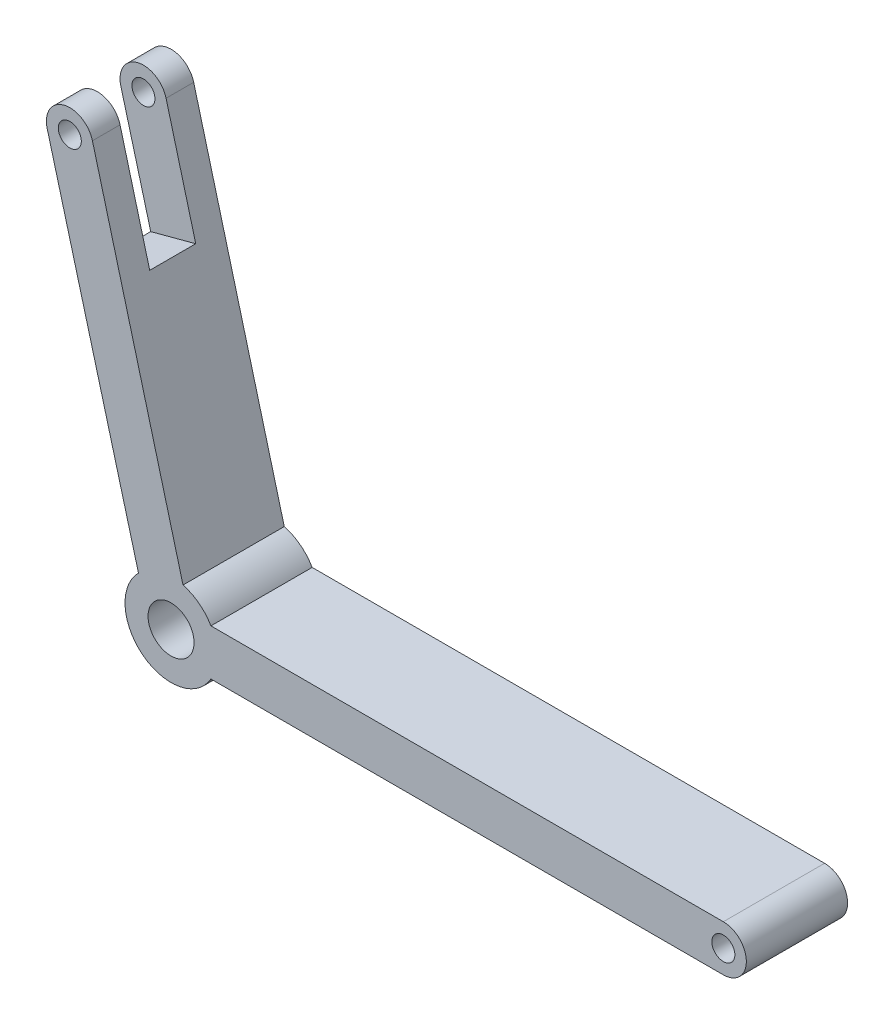
ISO-10303-21;
HEADER;
FILE_DESCRIPTION(('STEP AP214'),'2;1');
FILE_NAME('part.step','',(''),(''),'','','');
FILE_SCHEMA(('AUTOMOTIVE_DESIGN { 1 0 10303 214 1 1 1 1 }'));
ENDSEC;
DATA;
#1=APPLICATION_CONTEXT('core data for automotive mechanical design processes');
#2=APPLICATION_PROTOCOL_DEFINITION('international standard','automotive_design',2000,#1);
#3=PRODUCT_CONTEXT('',#1,'mechanical');
#4=PRODUCT('Part','Part','',(#3));
#5=PRODUCT_RELATED_PRODUCT_CATEGORY('part','',(#4));
#6=PRODUCT_DEFINITION_FORMATION('','',#4);
#7=PRODUCT_DEFINITION_CONTEXT('part definition',#1,'design');
#8=PRODUCT_DEFINITION('design','',#6,#7);
#9=PRODUCT_DEFINITION_SHAPE('','',#8);
#10=(LENGTH_UNIT() NAMED_UNIT(*) SI_UNIT(.MILLI.,.METRE.));
#11=(NAMED_UNIT(*) PLANE_ANGLE_UNIT() SI_UNIT($,.RADIAN.));
#12=(NAMED_UNIT(*) SI_UNIT($,.STERADIAN.) SOLID_ANGLE_UNIT());
#13=UNCERTAINTY_MEASURE_WITH_UNIT(LENGTH_MEASURE(1.E-05),#10,'distance_accuracy_value','');
#14=(GEOMETRIC_REPRESENTATION_CONTEXT(3) GLOBAL_UNCERTAINTY_ASSIGNED_CONTEXT((#13)) GLOBAL_UNIT_ASSIGNED_CONTEXT((#10,
#11,#12)) REPRESENTATION_CONTEXT('',''));
#15=CARTESIAN_POINT('',(0.,0.,0.));
#16=DIRECTION('',(0.,0.,1.));
#17=DIRECTION('',(1.,0.,0.));
#18=AXIS2_PLACEMENT_3D('',#15,#16,#17);
#19=CARTESIAN_POINT('',(82.9161224789474,118.415426808269,11.));
#20=DIRECTION('',(-0.966192489957133,-0.257821784088224,0.));
#21=DIRECTION('',(0.257821784088224,-0.966192489957133,0.));
#22=AXIS2_PLACEMENT_3D('',#19,#20,#21);
#23=PLANE('',#22);
#24=DIRECTION('',(-0.257821784088224,0.966192489957133,0.));
#25=VECTOR('',#24,1.);
#26=CARTESIAN_POINT('',(89.361667081153,94.2606145593405,-5.));
#27=LINE('',#26,#25);
#28=CARTESIAN_POINT('',(89.361667081153,94.2606145593405,-5.));
#29=VERTEX_POINT('',#28);
#30=CARTESIAN_POINT('',(82.9161224789474,118.415426808269,-5.));
#31=VERTEX_POINT('',#30);
#32=EDGE_CURVE('E221',#29,#31,#27,.T.);
#33=ORIENTED_EDGE('',*,*,#32,.F.);
#34=DIRECTION('',(0.,0.,1.));
#35=VECTOR('',#34,1.);
#36=CARTESIAN_POINT('',(89.361667081153,94.2606145593405,-5.));
#37=LINE('',#36,#35);
#38=CARTESIAN_POINT('',(89.361667081153,94.2606145593405,5.));
#39=VERTEX_POINT('',#38);
#40=EDGE_CURVE('E216',#29,#39,#37,.T.);
#41=ORIENTED_EDGE('',*,*,#40,.T.);
#42=DIRECTION('',(-0.257821784088224,0.966192489957133,0.));
#43=VECTOR('',#42,1.);
#44=CARTESIAN_POINT('',(89.361667081153,94.2606145593405,5.));
#45=LINE('',#44,#43);
#46=CARTESIAN_POINT('',(82.9161224789474,118.415426808269,5.));
#47=VERTEX_POINT('',#46);
#48=EDGE_CURVE('E132',#39,#47,#45,.T.);
#49=ORIENTED_EDGE('',*,*,#48,.T.);
#50=DIRECTION('',(0.,0.,-1.));
#51=VECTOR('',#50,1.);
#52=CARTESIAN_POINT('',(82.9161224789474,118.415426808269,11.));
#53=LINE('',#52,#51);
#54=CARTESIAN_POINT('',(82.9161224789474,118.415426808269,11.));
#55=VERTEX_POINT('',#54);
#56=EDGE_CURVE('E129',#55,#47,#53,.T.);
#57=ORIENTED_EDGE('',*,*,#56,.F.);
#58=DIRECTION('',(-0.257821784088224,0.966192489957133,0.));
#59=VECTOR('',#58,1.);
#60=CARTESIAN_POINT('',(82.9161224789474,118.415426808269,11.));
#61=LINE('',#60,#59);
#62=CARTESIAN_POINT('',(102.598160303091,44.6565813329273,11.));
#63=VERTEX_POINT('',#62);
#64=EDGE_CURVE('E114',#63,#55,#61,.T.);
#65=ORIENTED_EDGE('',*,*,#64,.F.);
#66=DIRECTION('',(0.,0.,-1.));
#67=VECTOR('',#66,1.);
#68=CARTESIAN_POINT('',(102.598160303091,44.6565813329273,11.));
#69=LINE('',#68,#67);
#70=CARTESIAN_POINT('',(102.598160303091,44.6565813329273,-11.));
#71=VERTEX_POINT('',#70);
#72=EDGE_CURVE('E135',#63,#71,#69,.T.);
#73=ORIENTED_EDGE('',*,*,#72,.T.);
#74=DIRECTION('',(-0.257821784088224,0.966192489957133,0.));
#75=VECTOR('',#74,1.);
#76=CARTESIAN_POINT('',(82.9161224789474,118.415426808269,-11.));
#77=LINE('',#76,#75);
#78=CARTESIAN_POINT('',(82.9161224789474,118.415426808269,-11.));
#79=VERTEX_POINT('',#78);
#80=EDGE_CURVE('E158',#71,#79,#77,.T.);
#81=ORIENTED_EDGE('',*,*,#80,.T.);
#82=EDGE_CURVE('E136',#31,#79,#53,.T.);
#83=ORIENTED_EDGE('',*,*,#82,.F.);
#84=EDGE_LOOP('',(#33,#41,#49,#57,#65,#73,#81,#83));
#85=FACE_BOUND('',#84,.T.);
#86=ADVANCED_FACE('F34',(#85),#23,.F.);
#87=CARTESIAN_POINT('',(78.000381166286,117.103695234571,11.));
#88=DIRECTION('',(0.,0.,-1.));
#89=DIRECTION('',(-1.,0.,0.));
#90=AXIS2_PLACEMENT_3D('',#87,#88,#89);
#91=CYLINDRICAL_SURFACE('',#90,5.08774531344114);
#92=CARTESIAN_POINT('',(78.000381166286,117.103695234571,-5.));
#93=DIRECTION('',(0.,0.,1.));
#94=DIRECTION('',(1.,0.,0.));
#95=AXIS2_PLACEMENT_3D('',#92,#93,#94);
#96=CIRCLE('',#95,5.08774531344114);
#97=CARTESIAN_POINT('',(73.0873585242395,115.781817444009,-5.));
#98=VERTEX_POINT('',#97);
#99=EDGE_CURVE('E224',#31,#98,#96,.T.);
#100=ORIENTED_EDGE('',*,*,#99,.F.);
#101=ORIENTED_EDGE('',*,*,#82,.T.);
#102=CARTESIAN_POINT('',(78.000381166286,117.103695234571,-11.));
#103=DIRECTION('',(0.,0.,1.));
#104=DIRECTION('',(1.,0.,0.));
#105=AXIS2_PLACEMENT_3D('',#102,#103,#104);
#106=CIRCLE('',#105,5.08774531344114);
#107=CARTESIAN_POINT('',(73.0873585242395,115.781817444009,-11.));
#108=VERTEX_POINT('',#107);
#109=EDGE_CURVE('E161',#79,#108,#106,.T.);
#110=ORIENTED_EDGE('',*,*,#109,.T.);
#111=DIRECTION('',(0.,0.,-1.));
#112=VECTOR('',#111,1.);
#113=CARTESIAN_POINT('',(73.0873585242395,115.781817444009,11.));
#114=LINE('',#113,#112);
#115=EDGE_CURVE('E167',#98,#108,#114,.T.);
#116=ORIENTED_EDGE('',*,*,#115,.F.);
#117=EDGE_LOOP('',(#100,#101,#110,#116));
#118=FACE_BOUND('',#117,.T.);
#119=ADVANCED_FACE('F266',(#118),#91,.T.);
#120=CARTESIAN_POINT('',(92.921636507955,42.06376459648,11.));
#121=DIRECTION('',(0.965658133292732,0.259816030309133,0.));
#122=DIRECTION('',(-0.259816030309133,0.965658133292732,0.));
#123=AXIS2_PLACEMENT_3D('',#120,#121,#122);
#124=PLANE('',#123);
#125=DIRECTION('',(0.259816030309133,-0.965658133292732,0.));
#126=VECTOR('',#125,1.);
#127=CARTESIAN_POINT('',(73.0873585242395,115.781817444009,-5.));
#128=LINE('',#127,#126);
#129=CARTESIAN_POINT('',(79.5800439780527,91.6504560806383,-5.));
#130=VERTEX_POINT('',#129);
#131=EDGE_CURVE('E237',#98,#130,#128,.T.);
#132=ORIENTED_EDGE('',*,*,#131,.F.);
#133=ORIENTED_EDGE('',*,*,#115,.T.);
#134=DIRECTION('',(0.259816030309133,-0.965658133292732,0.));
#135=VECTOR('',#134,1.);
#136=CARTESIAN_POINT('',(92.921636507955,42.06376459648,-11.));
#137=LINE('',#136,#135);
#138=CARTESIAN_POINT('',(92.921636507955,42.06376459648,-11.));
#139=VERTEX_POINT('',#138);
#140=EDGE_CURVE('E90',#108,#139,#137,.T.);
#141=ORIENTED_EDGE('',*,*,#140,.T.);
#142=DIRECTION('',(0.,0.,-1.));
#143=VECTOR('',#142,1.);
#144=CARTESIAN_POINT('',(92.921636507955,42.06376459648,11.));
#145=LINE('',#144,#143);
#146=CARTESIAN_POINT('',(92.921636507955,42.06376459648,11.));
#147=VERTEX_POINT('',#146);
#148=EDGE_CURVE('E142',#147,#139,#145,.T.);
#149=ORIENTED_EDGE('',*,*,#148,.F.);
#150=DIRECTION('',(0.259816030309133,-0.965658133292732,0.));
#151=VECTOR('',#150,1.);
#152=CARTESIAN_POINT('',(92.921636507955,42.06376459648,11.));
#153=LINE('',#152,#151);
#154=CARTESIAN_POINT('',(73.0873585242395,115.781817444009,11.));
#155=VERTEX_POINT('',#154);
#156=EDGE_CURVE('E58',#155,#147,#153,.T.);
#157=ORIENTED_EDGE('',*,*,#156,.F.);
#158=CARTESIAN_POINT('',(73.0873585242395,115.781817444009,5.));
#159=VERTEX_POINT('',#158);
#160=EDGE_CURVE('E140',#155,#159,#114,.T.);
#161=ORIENTED_EDGE('',*,*,#160,.T.);
#162=DIRECTION('',(0.259816030309133,-0.965658133292732,0.));
#163=VECTOR('',#162,1.);
#164=CARTESIAN_POINT('',(73.0873585242395,115.781817444009,5.));
#165=LINE('',#164,#163);
#166=CARTESIAN_POINT('',(79.5800439780527,91.6504560806383,5.));
#167=VERTEX_POINT('',#166);
#168=EDGE_CURVE('E226',#159,#167,#165,.T.);
#169=ORIENTED_EDGE('',*,*,#168,.T.);
#170=DIRECTION('',(0.,0.,1.));
#171=VECTOR('',#170,1.);
#172=CARTESIAN_POINT('',(79.5800439780527,91.6504560806383,-5.));
#173=LINE('',#172,#171);
#174=EDGE_CURVE('E219',#130,#167,#173,.T.);
#175=ORIENTED_EDGE('',*,*,#174,.F.);
#176=EDGE_LOOP('',(#132,#133,#141,#149,#157,#161,#169,#175));
#177=FACE_BOUND('',#176,.T.);
#178=ADVANCED_FACE('F265',(#177),#124,.F.);
#179=CARTESIAN_POINT('',(78.000381166286,117.103695234571,11.));
#180=DIRECTION('',(0.,0.,-1.));
#181=DIRECTION('',(-1.,0.,0.));
#182=AXIS2_PLACEMENT_3D('',#179,#180,#181);
#183=CYLINDRICAL_SURFACE('',#182,2.5);
#184=CARTESIAN_POINT('',(78.000381166286,117.103695234571,-11.));
#185=DIRECTION('',(0.,0.,1.));
#186=DIRECTION('',(1.,0.,0.));
#187=AXIS2_PLACEMENT_3D('',#184,#185,#186);
#188=CIRCLE('',#187,2.5);
#189=CARTESIAN_POINT('',(80.500381166286,117.103695234571,-11.));
#190=VERTEX_POINT('',#189);
#191=EDGE_CURVE('E201',#190,#190,#188,.T.);
#192=ORIENTED_EDGE('',*,*,#191,.F.);
#193=EDGE_LOOP('',(#192));
#194=FACE_BOUND('',#193,.T.);
#195=CARTESIAN_POINT('',(78.000381166286,117.103695234571,-5.));
#196=DIRECTION('',(0.,0.,1.));
#197=DIRECTION('',(1.,0.,0.));
#198=AXIS2_PLACEMENT_3D('',#195,#196,#197);
#199=CIRCLE('',#198,2.5);
#200=CARTESIAN_POINT('',(80.500381166286,117.103695234571,-5.));
#201=VERTEX_POINT('',#200);
#202=EDGE_CURVE('E231',#201,#201,#199,.T.);
#203=ORIENTED_EDGE('',*,*,#202,.T.);
#204=EDGE_LOOP('',(#203));
#205=FACE_BOUND('',#204,.T.);
#206=ADVANCED_FACE('F248',(#194,#205),#183,.F.);
#207=CARTESIAN_POINT('',(100.,35.,11.));
#208=DIRECTION('',(0.,0.,1.));
#209=DIRECTION('',(1.,0.,0.));
#210=AXIS2_PLACEMENT_3D('',#207,#208,#209);
#211=PLANE('',#210);
#212=CARTESIAN_POINT('',(100.,35.,11.));
#213=DIRECTION('',(0.,0.,1.));
#214=DIRECTION('',(1.,0.,0.));
#215=AXIS2_PLACEMENT_3D('',#212,#213,#214);
#216=CIRCLE('',#215,5.00000000000001);
#217=CARTESIAN_POINT('',(105.,35.,11.));
#218=VERTEX_POINT('',#217);
#219=EDGE_CURVE('E204',#218,#218,#216,.T.);
#220=ORIENTED_EDGE('',*,*,#219,.F.);
#221=EDGE_LOOP('',(#220));
#222=FACE_BOUND('',#221,.T.);
#223=CARTESIAN_POINT('',(100.,35.,11.));
#224=DIRECTION('',(0.,0.,1.));
#225=DIRECTION('',(1.,0.,0.));
#226=AXIS2_PLACEMENT_3D('',#223,#224,#225);
#227=CIRCLE('',#226,9.99999999999999);
#228=CARTESIAN_POINT('',(108.660254037844,30.,11.));
#229=VERTEX_POINT('',#228);
#230=EDGE_CURVE('E165',#147,#229,#227,.T.);
#231=ORIENTED_EDGE('',*,*,#230,.T.);
#232=DIRECTION('',(1.,0.,0.));
#233=VECTOR('',#232,1.);
#234=CARTESIAN_POINT('',(108.660254037844,30.,11.));
#235=LINE('',#234,#233);
#236=CARTESIAN_POINT('',(220.,30.,11.));
#237=VERTEX_POINT('',#236);
#238=EDGE_CURVE('E98',#229,#237,#235,.T.);
#239=ORIENTED_EDGE('',*,*,#238,.T.);
#240=CARTESIAN_POINT('',(220.,35.,11.));
#241=DIRECTION('',(0.,0.,1.));
#242=DIRECTION('',(1.,0.,0.));
#243=AXIS2_PLACEMENT_3D('',#240,#241,#242);
#244=CIRCLE('',#243,5.00000000000002);
#245=CARTESIAN_POINT('',(220.,40.,11.));
#246=VERTEX_POINT('',#245);
#247=EDGE_CURVE('E181',#237,#246,#244,.T.);
#248=ORIENTED_EDGE('',*,*,#247,.T.);
#249=DIRECTION('',(-1.,0.,0.));
#250=VECTOR('',#249,1.);
#251=CARTESIAN_POINT('',(108.660254037844,40.,11.));
#252=LINE('',#251,#250);
#253=CARTESIAN_POINT('',(108.660254037844,40.,11.));
#254=VERTEX_POINT('',#253);
#255=EDGE_CURVE('E195',#246,#254,#252,.T.);
#256=ORIENTED_EDGE('',*,*,#255,.T.);
#257=CARTESIAN_POINT('',(100.,35.,11.));
#258=DIRECTION('',(0.,0.,1.));
#259=DIRECTION('',(1.,0.,0.));
#260=AXIS2_PLACEMENT_3D('',#257,#258,#259);
#261=CIRCLE('',#260,9.99999999999999);
#262=EDGE_CURVE('E122',#254,#63,#261,.T.);
#263=ORIENTED_EDGE('',*,*,#262,.T.);
#264=ORIENTED_EDGE('',*,*,#64,.T.);
#265=CARTESIAN_POINT('',(78.000381166286,117.103695234571,11.));
#266=DIRECTION('',(0.,0.,1.));
#267=DIRECTION('',(1.,0.,0.));
#268=AXIS2_PLACEMENT_3D('',#265,#266,#267);
#269=CIRCLE('',#268,5.08774531344114);
#270=EDGE_CURVE('E119',#55,#155,#269,.T.);
#271=ORIENTED_EDGE('',*,*,#270,.T.);
#272=ORIENTED_EDGE('',*,*,#156,.T.);
#273=EDGE_LOOP('',(#231,#239,#248,#256,#263,#264,#271,#272));
#274=FACE_BOUND('',#273,.T.);
#275=CARTESIAN_POINT('',(78.000381166286,117.103695234571,11.));
#276=DIRECTION('',(0.,0.,1.));
#277=DIRECTION('',(1.,0.,0.));
#278=AXIS2_PLACEMENT_3D('',#275,#276,#277);
#279=CIRCLE('',#278,2.5);
#280=CARTESIAN_POINT('',(80.500381166286,117.103695234571,11.));
#281=VERTEX_POINT('',#280);
#282=EDGE_CURVE('E150',#281,#281,#279,.T.);
#283=ORIENTED_EDGE('',*,*,#282,.F.);
#284=EDGE_LOOP('',(#283));
#285=FACE_BOUND('',#284,.T.);
#286=CARTESIAN_POINT('',(220.,35.,11.));
#287=DIRECTION('',(0.,0.,1.));
#288=DIRECTION('',(1.,0.,0.));
#289=AXIS2_PLACEMENT_3D('',#286,#287,#288);
#290=CIRCLE('',#289,2.5);
#291=CARTESIAN_POINT('',(222.5,35.,11.));
#292=VERTEX_POINT('',#291);
#293=EDGE_CURVE('E210',#292,#292,#290,.T.);
#294=ORIENTED_EDGE('',*,*,#293,.F.);
#295=EDGE_LOOP('',(#294));
#296=FACE_BOUND('',#295,.T.);
#297=ADVANCED_FACE('F116',(#222,#274,#285,#296),#211,.T.);
#298=CARTESIAN_POINT('',(100.,35.,-11.));
#299=DIRECTION('',(0.,0.,1.));
#300=DIRECTION('',(1.,0.,0.));
#301=AXIS2_PLACEMENT_3D('',#298,#299,#300);
#302=PLANE('',#301);
#303=CARTESIAN_POINT('',(100.,35.,-11.));
#304=DIRECTION('',(0.,0.,1.));
#305=DIRECTION('',(1.,0.,0.));
#306=AXIS2_PLACEMENT_3D('',#303,#304,#305);
#307=CIRCLE('',#306,9.99999999999999);
#308=CARTESIAN_POINT('',(108.660254037844,30.,-11.));
#309=VERTEX_POINT('',#308);
#310=EDGE_CURVE('E146',#139,#309,#307,.T.);
#311=ORIENTED_EDGE('',*,*,#310,.F.);
#312=ORIENTED_EDGE('',*,*,#140,.F.);
#313=ORIENTED_EDGE('',*,*,#109,.F.);
#314=ORIENTED_EDGE('',*,*,#80,.F.);
#315=CARTESIAN_POINT('',(100.,35.,-11.));
#316=DIRECTION('',(0.,0.,1.));
#317=DIRECTION('',(1.,0.,0.));
#318=AXIS2_PLACEMENT_3D('',#315,#316,#317);
#319=CIRCLE('',#318,9.99999999999999);
#320=CARTESIAN_POINT('',(108.660254037844,40.,-11.));
#321=VERTEX_POINT('',#320);
#322=EDGE_CURVE('E156',#321,#71,#319,.T.);
#323=ORIENTED_EDGE('',*,*,#322,.F.);
#324=DIRECTION('',(-1.,0.,0.));
#325=VECTOR('',#324,1.);
#326=CARTESIAN_POINT('',(108.660254037844,40.,-11.));
#327=LINE('',#326,#325);
#328=CARTESIAN_POINT('',(220.,40.,-11.));
#329=VERTEX_POINT('',#328);
#330=EDGE_CURVE('E154',#329,#321,#327,.T.);
#331=ORIENTED_EDGE('',*,*,#330,.F.);
#332=CARTESIAN_POINT('',(220.,35.,-11.));
#333=DIRECTION('',(0.,0.,1.));
#334=DIRECTION('',(1.,0.,0.));
#335=AXIS2_PLACEMENT_3D('',#332,#333,#334);
#336=CIRCLE('',#335,5.00000000000002);
#337=CARTESIAN_POINT('',(220.,30.,-11.));
#338=VERTEX_POINT('',#337);
#339=EDGE_CURVE('E152',#338,#329,#336,.T.);
#340=ORIENTED_EDGE('',*,*,#339,.F.);
#341=DIRECTION('',(1.,0.,0.));
#342=VECTOR('',#341,1.);
#343=CARTESIAN_POINT('',(108.660254037844,30.,-11.));
#344=LINE('',#343,#342);
#345=EDGE_CURVE('E149',#309,#338,#344,.T.);
#346=ORIENTED_EDGE('',*,*,#345,.F.);
#347=EDGE_LOOP('',(#311,#312,#313,#314,#323,#331,#340,#346));
#348=FACE_BOUND('',#347,.T.);
#349=ORIENTED_EDGE('',*,*,#191,.T.);
#350=EDGE_LOOP('',(#349));
#351=FACE_BOUND('',#350,.T.);
#352=CARTESIAN_POINT('',(100.,35.,-11.));
#353=DIRECTION('',(0.,0.,1.));
#354=DIRECTION('',(1.,0.,0.));
#355=AXIS2_PLACEMENT_3D('',#352,#353,#354);
#356=CIRCLE('',#355,5.00000000000001);
#357=CARTESIAN_POINT('',(105.,35.,-11.));
#358=VERTEX_POINT('',#357);
#359=EDGE_CURVE('E207',#358,#358,#356,.T.);
#360=ORIENTED_EDGE('',*,*,#359,.T.);
#361=EDGE_LOOP('',(#360));
#362=FACE_BOUND('',#361,.T.);
#363=CARTESIAN_POINT('',(220.,35.,-11.));
#364=DIRECTION('',(0.,0.,1.));
#365=DIRECTION('',(1.,0.,0.));
#366=AXIS2_PLACEMENT_3D('',#363,#364,#365);
#367=CIRCLE('',#366,2.5);
#368=CARTESIAN_POINT('',(222.5,35.,-11.));
#369=VERTEX_POINT('',#368);
#370=EDGE_CURVE('E213',#369,#369,#367,.T.);
#371=ORIENTED_EDGE('',*,*,#370,.T.);
#372=EDGE_LOOP('',(#371));
#373=FACE_BOUND('',#372,.T.);
#374=ADVANCED_FACE('F185',(#348,#351,#362,#373),#302,.F.);
#375=CARTESIAN_POINT('',(100.,35.,11.));
#376=DIRECTION('',(0.,0.,-1.));
#377=DIRECTION('',(-1.,0.,0.));
#378=AXIS2_PLACEMENT_3D('',#375,#376,#377);
#379=CYLINDRICAL_SURFACE('',#378,9.99999999999999);
#380=ORIENTED_EDGE('',*,*,#310,.T.);
#381=DIRECTION('',(0.,0.,-1.));
#382=VECTOR('',#381,1.);
#383=CARTESIAN_POINT('',(108.660254037844,30.,11.));
#384=LINE('',#383,#382);
#385=EDGE_CURVE('E11',#229,#309,#384,.T.);
#386=ORIENTED_EDGE('',*,*,#385,.F.);
#387=ORIENTED_EDGE('',*,*,#230,.F.);
#388=ORIENTED_EDGE('',*,*,#148,.T.);
#389=EDGE_LOOP('',(#380,#386,#387,#388));
#390=FACE_BOUND('',#389,.T.);
#391=ADVANCED_FACE('F36',(#390),#379,.T.);
#392=CARTESIAN_POINT('',(108.660254037844,30.,11.));
#393=DIRECTION('',(0.,1.,0.));
#394=DIRECTION('',(-1.,0.,0.));
#395=AXIS2_PLACEMENT_3D('',#392,#393,#394);
#396=PLANE('',#395);
#397=ORIENTED_EDGE('',*,*,#345,.T.);
#398=DIRECTION('',(0.,0.,-1.));
#399=VECTOR('',#398,1.);
#400=CARTESIAN_POINT('',(220.,30.,11.));
#401=LINE('',#400,#399);
#402=EDGE_CURVE('E42',#237,#338,#401,.T.);
#403=ORIENTED_EDGE('',*,*,#402,.F.);
#404=ORIENTED_EDGE('',*,*,#238,.F.);
#405=ORIENTED_EDGE('',*,*,#385,.T.);
#406=EDGE_LOOP('',(#397,#403,#404,#405));
#407=FACE_BOUND('',#406,.T.);
#408=ADVANCED_FACE('F301',(#407),#396,.F.);
#409=CARTESIAN_POINT('',(220.,35.,11.));
#410=DIRECTION('',(0.,0.,-1.));
#411=DIRECTION('',(-1.,0.,0.));
#412=AXIS2_PLACEMENT_3D('',#409,#410,#411);
#413=CYLINDRICAL_SURFACE('',#412,5.00000000000002);
#414=ORIENTED_EDGE('',*,*,#339,.T.);
#415=DIRECTION('',(0.,0.,-1.));
#416=VECTOR('',#415,1.);
#417=CARTESIAN_POINT('',(220.,40.,11.));
#418=LINE('',#417,#416);
#419=EDGE_CURVE('E173',#246,#329,#418,.T.);
#420=ORIENTED_EDGE('',*,*,#419,.F.);
#421=ORIENTED_EDGE('',*,*,#247,.F.);
#422=ORIENTED_EDGE('',*,*,#402,.T.);
#423=EDGE_LOOP('',(#414,#420,#421,#422));
#424=FACE_BOUND('',#423,.T.);
#425=ADVANCED_FACE('F179',(#424),#413,.T.);
#426=CARTESIAN_POINT('',(108.660254037844,40.,11.));
#427=DIRECTION('',(0.,-1.,0.));
#428=DIRECTION('',(1.,0.,0.));
#429=AXIS2_PLACEMENT_3D('',#426,#427,#428);
#430=PLANE('',#429);
#431=ORIENTED_EDGE('',*,*,#330,.T.);
#432=DIRECTION('',(0.,0.,-1.));
#433=VECTOR('',#432,1.);
#434=CARTESIAN_POINT('',(108.660254037844,40.,11.));
#435=LINE('',#434,#433);
#436=EDGE_CURVE('E170',#254,#321,#435,.T.);
#437=ORIENTED_EDGE('',*,*,#436,.F.);
#438=ORIENTED_EDGE('',*,*,#255,.F.);
#439=ORIENTED_EDGE('',*,*,#419,.T.);
#440=EDGE_LOOP('',(#431,#437,#438,#439));
#441=FACE_BOUND('',#440,.T.);
#442=ADVANCED_FACE('F191',(#441),#430,.F.);
#443=CARTESIAN_POINT('',(100.,35.,11.));
#444=DIRECTION('',(0.,0.,-1.));
#445=DIRECTION('',(-1.,0.,0.));
#446=AXIS2_PLACEMENT_3D('',#443,#444,#445);
#447=CYLINDRICAL_SURFACE('',#446,9.99999999999999);
#448=ORIENTED_EDGE('',*,*,#322,.T.);
#449=ORIENTED_EDGE('',*,*,#72,.F.);
#450=ORIENTED_EDGE('',*,*,#262,.F.);
#451=ORIENTED_EDGE('',*,*,#436,.T.);
#452=EDGE_LOOP('',(#448,#449,#450,#451));
#453=FACE_BOUND('',#452,.T.);
#454=ADVANCED_FACE('F194',(#453),#447,.T.);
#455=ORIENTED_EDGE('',*,*,#56,.T.);
#456=CARTESIAN_POINT('',(78.000381166286,117.103695234571,5.));
#457=DIRECTION('',(0.,0.,1.));
#458=DIRECTION('',(1.,0.,0.));
#459=AXIS2_PLACEMENT_3D('',#456,#457,#458);
#460=CIRCLE('',#459,5.08774531344114);
#461=EDGE_CURVE('E229',#47,#159,#460,.T.);
#462=ORIENTED_EDGE('',*,*,#461,.T.);
#463=ORIENTED_EDGE('',*,*,#160,.F.);
#464=ORIENTED_EDGE('',*,*,#270,.F.);
#465=EDGE_LOOP('',(#455,#462,#463,#464));
#466=FACE_BOUND('',#465,.T.);
#467=ADVANCED_FACE('F138',(#466),#91,.T.);
#468=CARTESIAN_POINT('',(78.000381166286,117.103695234571,5.));
#469=DIRECTION('',(0.,0.,1.));
#470=DIRECTION('',(1.,0.,0.));
#471=AXIS2_PLACEMENT_3D('',#468,#469,#470);
#472=CIRCLE('',#471,2.5);
#473=CARTESIAN_POINT('',(80.500381166286,117.103695234571,5.));
#474=VERTEX_POINT('',#473);
#475=EDGE_CURVE('E242',#474,#474,#472,.T.);
#476=ORIENTED_EDGE('',*,*,#475,.F.);
#477=EDGE_LOOP('',(#476));
#478=FACE_BOUND('',#477,.T.);
#479=ORIENTED_EDGE('',*,*,#282,.T.);
#480=EDGE_LOOP('',(#479));
#481=FACE_BOUND('',#480,.T.);
#482=ADVANCED_FACE('F321',(#478,#481),#183,.F.);
#483=CARTESIAN_POINT('',(100.,35.,11.));
#484=DIRECTION('',(0.,0.,-1.));
#485=DIRECTION('',(-1.,0.,0.));
#486=AXIS2_PLACEMENT_3D('',#483,#484,#485);
#487=CYLINDRICAL_SURFACE('',#486,5.00000000000001);
#488=ORIENTED_EDGE('',*,*,#219,.T.);
#489=EDGE_LOOP('',(#488));
#490=FACE_BOUND('',#489,.T.);
#491=ORIENTED_EDGE('',*,*,#359,.F.);
#492=EDGE_LOOP('',(#491));
#493=FACE_BOUND('',#492,.T.);
#494=ADVANCED_FACE('F327',(#490,#493),#487,.F.);
#495=CARTESIAN_POINT('',(220.,35.,11.));
#496=DIRECTION('',(0.,0.,-1.));
#497=DIRECTION('',(-1.,0.,0.));
#498=AXIS2_PLACEMENT_3D('',#495,#496,#497);
#499=CYLINDRICAL_SURFACE('',#498,2.5);
#500=ORIENTED_EDGE('',*,*,#293,.T.);
#501=EDGE_LOOP('',(#500));
#502=FACE_BOUND('',#501,.T.);
#503=ORIENTED_EDGE('',*,*,#370,.F.);
#504=EDGE_LOOP('',(#503));
#505=FACE_BOUND('',#504,.T.);
#506=ADVANCED_FACE('F333',(#502,#505),#499,.F.);
#507=CARTESIAN_POINT('',(79.5800439780527,91.6504560806383,-5.));
#508=DIRECTION('',(0.257821784088224,-0.966192489957133,0.));
#509=DIRECTION('',(0.966192489957133,0.257821784088224,0.));
#510=AXIS2_PLACEMENT_3D('',#507,#508,#509);
#511=PLANE('',#510);
#512=DIRECTION('',(0.966192489957134,0.257821784088224,0.));
#513=VECTOR('',#512,1.);
#514=CARTESIAN_POINT('',(79.5800439780527,91.6504560806383,5.));
#515=LINE('',#514,#513);
#516=EDGE_CURVE('E49',#167,#39,#515,.T.);
#517=ORIENTED_EDGE('',*,*,#516,.T.);
#518=ORIENTED_EDGE('',*,*,#40,.F.);
#519=DIRECTION('',(0.966192489957134,0.257821784088224,0.));
#520=VECTOR('',#519,1.);
#521=CARTESIAN_POINT('',(79.5800439780527,91.6504560806383,-5.));
#522=LINE('',#521,#520);
#523=EDGE_CURVE('E234',#130,#29,#522,.T.);
#524=ORIENTED_EDGE('',*,*,#523,.F.);
#525=ORIENTED_EDGE('',*,*,#174,.T.);
#526=EDGE_LOOP('',(#517,#518,#524,#525));
#527=FACE_BOUND('',#526,.T.);
#528=ADVANCED_FACE('F254',(#527),#511,.F.);
#529=CARTESIAN_POINT('',(78.000381166286,117.103695234571,-5.));
#530=DIRECTION('',(0.,0.,1.));
#531=DIRECTION('',(1.,0.,0.));
#532=AXIS2_PLACEMENT_3D('',#529,#530,#531);
#533=PLANE('',#532);
#534=ORIENTED_EDGE('',*,*,#202,.F.);
#535=EDGE_LOOP('',(#534));
#536=FACE_BOUND('',#535,.T.);
#537=ORIENTED_EDGE('',*,*,#99,.T.);
#538=ORIENTED_EDGE('',*,*,#131,.T.);
#539=ORIENTED_EDGE('',*,*,#523,.T.);
#540=ORIENTED_EDGE('',*,*,#32,.T.);
#541=EDGE_LOOP('',(#537,#538,#539,#540));
#542=FACE_BOUND('',#541,.T.);
#543=ADVANCED_FACE('F250',(#536,#542),#533,.T.);
#544=CARTESIAN_POINT('',(78.000381166286,117.103695234571,5.));
#545=DIRECTION('',(0.,0.,1.));
#546=DIRECTION('',(1.,0.,0.));
#547=AXIS2_PLACEMENT_3D('',#544,#545,#546);
#548=PLANE('',#547);
#549=ORIENTED_EDGE('',*,*,#475,.T.);
#550=EDGE_LOOP('',(#549));
#551=FACE_BOUND('',#550,.T.);
#552=ORIENTED_EDGE('',*,*,#461,.F.);
#553=ORIENTED_EDGE('',*,*,#48,.F.);
#554=ORIENTED_EDGE('',*,*,#516,.F.);
#555=ORIENTED_EDGE('',*,*,#168,.F.);
#556=EDGE_LOOP('',(#552,#553,#554,#555));
#557=FACE_BOUND('',#556,.T.);
#558=ADVANCED_FACE('F253',(#551,#557),#548,.F.);
#559=CLOSED_SHELL('',(#86,#119,#178,#206,#297,#374,#391,#408,#425,#442,#454,#467,#482,#494,#506,
#528,#543,#558));
#560=MANIFOLD_SOLID_BREP('B2',#559);
#561=ADVANCED_BREP_SHAPE_REPRESENTATION('',(#18,#560),#14);
#562=SHAPE_DEFINITION_REPRESENTATION(#9,#561);
ENDSEC;
END-ISO-10303-21;
